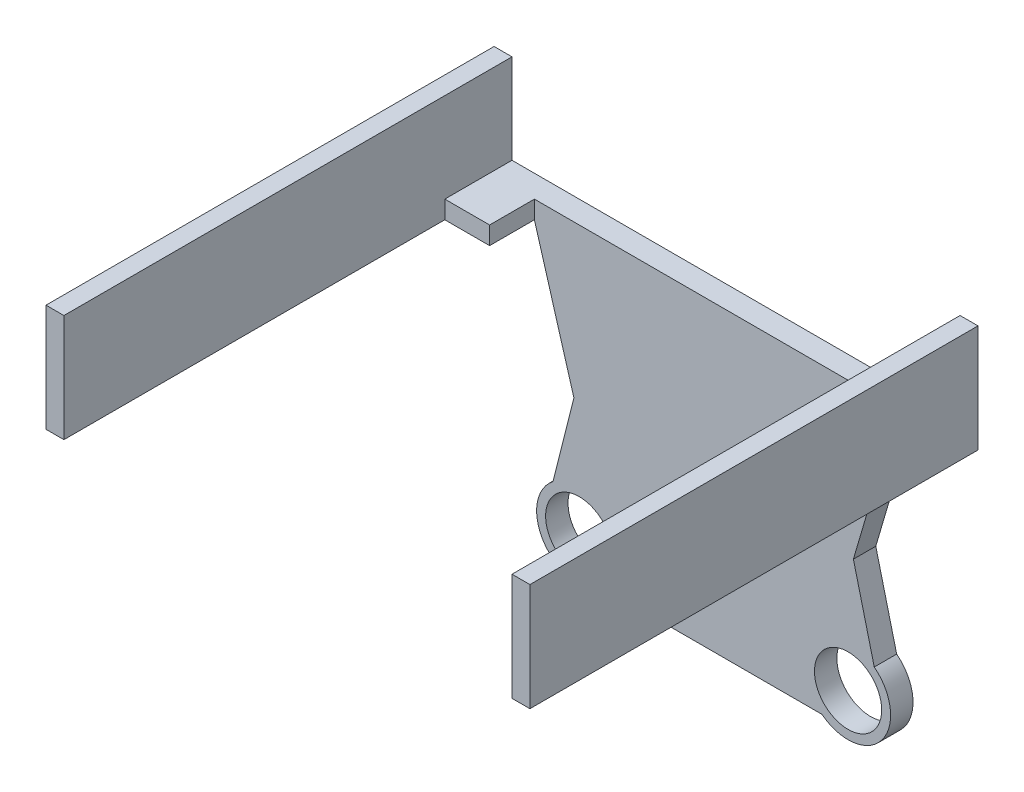
ISO-10303-21;
HEADER;
FILE_DESCRIPTION(('STEP AP214'),'2;1');
FILE_NAME('part.step','',(''),(''),'','','');
FILE_SCHEMA(('AUTOMOTIVE_DESIGN { 1 0 10303 214 1 1 1 1 }'));
ENDSEC;
DATA;
#1=APPLICATION_CONTEXT('core data for automotive mechanical design processes');
#2=APPLICATION_PROTOCOL_DEFINITION('international standard','automotive_design',2000,#1);
#3=PRODUCT_CONTEXT('',#1,'mechanical');
#4=PRODUCT('Part','Part','',(#3));
#5=PRODUCT_RELATED_PRODUCT_CATEGORY('part','',(#4));
#6=PRODUCT_DEFINITION_FORMATION('','',#4);
#7=PRODUCT_DEFINITION_CONTEXT('part definition',#1,'design');
#8=PRODUCT_DEFINITION('design','',#6,#7);
#9=PRODUCT_DEFINITION_SHAPE('','',#8);
#10=(LENGTH_UNIT() NAMED_UNIT(*) SI_UNIT(.MILLI.,.METRE.));
#11=(NAMED_UNIT(*) PLANE_ANGLE_UNIT() SI_UNIT($,.RADIAN.));
#12=(NAMED_UNIT(*) SI_UNIT($,.STERADIAN.) SOLID_ANGLE_UNIT());
#13=UNCERTAINTY_MEASURE_WITH_UNIT(LENGTH_MEASURE(1.E-05),#10,'distance_accuracy_value','');
#14=(GEOMETRIC_REPRESENTATION_CONTEXT(3) GLOBAL_UNCERTAINTY_ASSIGNED_CONTEXT((#13)) GLOBAL_UNIT_ASSIGNED_CONTEXT((#10,
#11,#12)) REPRESENTATION_CONTEXT('',''));
#15=CARTESIAN_POINT('',(0.,0.,0.));
#16=DIRECTION('',(0.,0.,1.));
#17=DIRECTION('',(1.,0.,0.));
#18=AXIS2_PLACEMENT_3D('',#15,#16,#17);
#19=CARTESIAN_POINT('',(0.,0.,2.5));
#20=DIRECTION('',(0.,0.,1.));
#21=DIRECTION('',(1.,0.,0.));
#22=AXIS2_PLACEMENT_3D('',#19,#20,#21);
#23=PLANE('',#22);
#24=CARTESIAN_POINT('',(15.,185.,2.5));
#25=DIRECTION('',(0.,0.,1.));
#26=DIRECTION('',(1.,0.,0.));
#27=AXIS2_PLACEMENT_3D('',#24,#25,#26);
#28=CIRCLE('',#27,3.75);
#29=CARTESIAN_POINT('',(18.75,185.,2.5));
#30=VERTEX_POINT('',#29);
#31=EDGE_CURVE('E261',#30,#30,#28,.T.);
#32=ORIENTED_EDGE('',*,*,#31,.F.);
#33=EDGE_LOOP('',(#32));
#34=FACE_BOUND('',#33,.T.);
#35=CARTESIAN_POINT('',(-15.,185.,2.5));
#36=DIRECTION('',(0.,0.,1.));
#37=DIRECTION('',(1.,0.,0.));
#38=AXIS2_PLACEMENT_3D('',#35,#36,#37);
#39=CIRCLE('',#38,3.75);
#40=CARTESIAN_POINT('',(-11.25,185.,2.5));
#41=VERTEX_POINT('',#40);
#42=EDGE_CURVE('E264',#41,#41,#39,.T.);
#43=ORIENTED_EDGE('',*,*,#42,.F.);
#44=EDGE_LOOP('',(#43));
#45=FACE_BOUND('',#44,.T.);
#46=DIRECTION('',(1.,0.,0.));
#47=VECTOR('',#46,1.);
#48=CARTESIAN_POINT('',(0.,215.,2.5));
#49=LINE('',#48,#47);
#50=CARTESIAN_POINT('',(-20.,215.,2.5));
#51=VERTEX_POINT('',#50);
#52=CARTESIAN_POINT('',(20.,215.,2.5));
#53=VERTEX_POINT('',#52);
#54=EDGE_CURVE('E56',#51,#53,#49,.T.);
#55=ORIENTED_EDGE('',*,*,#54,.F.);
#56=DIRECTION('',(0.,1.,0.));
#57=VECTOR('',#56,1.);
#58=CARTESIAN_POINT('',(-20.,213.,2.5));
#59=LINE('',#58,#57);
#60=CARTESIAN_POINT('',(-20.,213.,2.5));
#61=VERTEX_POINT('',#60);
#62=EDGE_CURVE('E214',#61,#51,#59,.T.);
#63=ORIENTED_EDGE('',*,*,#62,.F.);
#64=DIRECTION('',(0.281819559619809,-0.959467423009086,0.));
#65=VECTOR('',#64,1.);
#66=CARTESIAN_POINT('',(39.1829395341665,11.5090085388171,2.5));
#67=LINE('',#66,#65);
#68=CARTESIAN_POINT('',(-15.594125143885,198.,2.5));
#69=VERTEX_POINT('',#68);
#70=EDGE_CURVE('E280',#61,#69,#67,.T.);
#71=ORIENTED_EDGE('',*,*,#70,.T.);
#72=DIRECTION('',(-0.244142574636941,-0.969739348098058,0.));
#73=VECTOR('',#72,1.);
#74=CARTESIAN_POINT('',(-61.542050920823,15.4938899712752,2.5));
#75=LINE('',#74,#73);
#76=CARTESIAN_POINT('',(-17.9247307512719,188.742786399538,2.5));
#77=VERTEX_POINT('',#76);
#78=EDGE_CURVE('E282',#69,#77,#75,.T.);
#79=ORIENTED_EDGE('',*,*,#78,.T.);
#80=CARTESIAN_POINT('',(-15.,185.,2.5));
#81=DIRECTION('',(0.,0.,1.));
#82=DIRECTION('',(1.,0.,0.));
#83=AXIS2_PLACEMENT_3D('',#80,#81,#82);
#84=CIRCLE('',#83,4.75000000000001);
#85=CARTESIAN_POINT('',(-12.0845240525773,181.25,2.5));
#86=VERTEX_POINT('',#85);
#87=EDGE_CURVE('E284',#77,#86,#84,.T.);
#88=ORIENTED_EDGE('',*,*,#87,.T.);
#89=DIRECTION('',(1.,0.,0.));
#90=VECTOR('',#89,1.);
#91=CARTESIAN_POINT('',(0.,181.25,2.5));
#92=LINE('',#91,#90);
#93=CARTESIAN_POINT('',(12.0845240525773,181.25,2.5));
#94=VERTEX_POINT('',#93);
#95=EDGE_CURVE('E268',#86,#94,#92,.T.);
#96=ORIENTED_EDGE('',*,*,#95,.T.);
#97=CARTESIAN_POINT('',(15.,185.,2.5));
#98=DIRECTION('',(0.,0.,1.));
#99=DIRECTION('',(1.,0.,0.));
#100=AXIS2_PLACEMENT_3D('',#97,#98,#99);
#101=CIRCLE('',#100,4.75);
#102=CARTESIAN_POINT('',(17.9247307512719,188.742786399538,2.5));
#103=VERTEX_POINT('',#102);
#104=EDGE_CURVE('E271',#94,#103,#101,.T.);
#105=ORIENTED_EDGE('',*,*,#104,.T.);
#106=DIRECTION('',(0.244142574636941,-0.969739348098058,0.));
#107=VECTOR('',#106,1.);
#108=CARTESIAN_POINT('',(61.542050920823,15.4938899712752,2.5));
#109=LINE('',#108,#107);
#110=CARTESIAN_POINT('',(15.5941251438851,198.,2.5));
#111=VERTEX_POINT('',#110);
#112=EDGE_CURVE('E273',#111,#103,#109,.T.);
#113=ORIENTED_EDGE('',*,*,#112,.F.);
#114=DIRECTION('',(-0.281819559619809,-0.959467423009086,0.));
#115=VECTOR('',#114,1.);
#116=CARTESIAN_POINT('',(-39.1829395341665,11.5090085388171,2.5));
#117=LINE('',#116,#115);
#118=CARTESIAN_POINT('',(20.,213.,2.5));
#119=VERTEX_POINT('',#118);
#120=EDGE_CURVE('E276',#119,#111,#117,.T.);
#121=ORIENTED_EDGE('',*,*,#120,.F.);
#122=DIRECTION('',(0.,-1.,0.));
#123=VECTOR('',#122,1.);
#124=CARTESIAN_POINT('',(20.,213.,2.5));
#125=LINE('',#124,#123);
#126=EDGE_CURVE('E216',#53,#119,#125,.T.);
#127=ORIENTED_EDGE('',*,*,#126,.F.);
#128=EDGE_LOOP('',(#55,#63,#71,#79,#88,#96,#105,#113,#121,#127));
#129=FACE_BOUND('',#128,.T.);
#130=ADVANCED_FACE('F41',(#34,#45,#129),#23,.T.);
#131=CARTESIAN_POINT('',(25.,0.,2.5));
#132=DIRECTION('',(1.,0.,0.));
#133=DIRECTION('',(0.,0.,-1.));
#134=AXIS2_PLACEMENT_3D('',#131,#132,#133);
#135=PLANE('',#134);
#136=DIRECTION('',(0.,0.,-1.));
#137=VECTOR('',#136,1.);
#138=CARTESIAN_POINT('',(25.,215.,2.5));
#139=LINE('',#138,#137);
#140=CARTESIAN_POINT('',(25.,215.,7.5));
#141=VERTEX_POINT('',#140);
#142=CARTESIAN_POINT('',(25.,215.,0.));
#143=VERTEX_POINT('',#142);
#144=EDGE_CURVE('E351',#141,#143,#139,.T.);
#145=ORIENTED_EDGE('',*,*,#144,.F.);
#146=DIRECTION('',(0.,1.,0.));
#147=VECTOR('',#146,1.);
#148=CARTESIAN_POINT('',(25.,213.,7.5));
#149=LINE('',#148,#147);
#150=CARTESIAN_POINT('',(25.,213.,7.5));
#151=VERTEX_POINT('',#150);
#152=EDGE_CURVE('E225',#151,#141,#149,.T.);
#153=ORIENTED_EDGE('',*,*,#152,.F.);
#154=DIRECTION('',(0.,0.,-1.));
#155=VECTOR('',#154,1.);
#156=CARTESIAN_POINT('',(25.,213.,2.5));
#157=LINE('',#156,#155);
#158=CARTESIAN_POINT('',(25.,213.,50.));
#159=VERTEX_POINT('',#158);
#160=EDGE_CURVE('E233',#159,#151,#157,.T.);
#161=ORIENTED_EDGE('',*,*,#160,.F.);
#162=DIRECTION('',(0.,1.,0.));
#163=VECTOR('',#162,1.);
#164=CARTESIAN_POINT('',(25.,165.457913381931,50.));
#165=LINE('',#164,#163);
#166=CARTESIAN_POINT('',(25.,225.,50.));
#167=VERTEX_POINT('',#166);
#168=EDGE_CURVE('E243',#159,#167,#165,.T.);
#169=ORIENTED_EDGE('',*,*,#168,.T.);
#170=DIRECTION('',(0.,0.,-1.));
#171=VECTOR('',#170,1.);
#172=CARTESIAN_POINT('',(25.,225.,2.5));
#173=LINE('',#172,#171);
#174=CARTESIAN_POINT('',(25.,225.,0.));
#175=VERTEX_POINT('',#174);
#176=EDGE_CURVE('E353',#167,#175,#173,.T.);
#177=ORIENTED_EDGE('',*,*,#176,.T.);
#178=DIRECTION('',(0.,-1.,0.));
#179=VECTOR('',#178,1.);
#180=CARTESIAN_POINT('',(25.,0.,0.));
#181=LINE('',#180,#179);
#182=EDGE_CURVE('E313',#175,#143,#181,.T.);
#183=ORIENTED_EDGE('',*,*,#182,.T.);
#184=EDGE_LOOP('',(#145,#153,#161,#169,#177,#183));
#185=FACE_BOUND('',#184,.T.);
#186=ADVANCED_FACE('F413',(#185),#135,.F.);
#187=CARTESIAN_POINT('',(-25.,0.,2.5));
#188=DIRECTION('',(-1.,0.,0.));
#189=DIRECTION('',(0.,0.,1.));
#190=AXIS2_PLACEMENT_3D('',#187,#188,#189);
#191=PLANE('',#190);
#192=DIRECTION('',(0.,-1.,0.));
#193=VECTOR('',#192,1.);
#194=CARTESIAN_POINT('',(-25.,213.,7.5));
#195=LINE('',#194,#193);
#196=CARTESIAN_POINT('',(-25.,215.,7.5));
#197=VERTEX_POINT('',#196);
#198=CARTESIAN_POINT('',(-25.,213.,7.5));
#199=VERTEX_POINT('',#198);
#200=EDGE_CURVE('E194',#197,#199,#195,.T.);
#201=ORIENTED_EDGE('',*,*,#200,.F.);
#202=DIRECTION('',(0.,0.,-1.));
#203=VECTOR('',#202,1.);
#204=CARTESIAN_POINT('',(-25.,215.,2.5));
#205=LINE('',#204,#203);
#206=CARTESIAN_POINT('',(-25.,215.,0.));
#207=VERTEX_POINT('',#206);
#208=EDGE_CURVE('E64',#197,#207,#205,.T.);
#209=ORIENTED_EDGE('',*,*,#208,.T.);
#210=DIRECTION('',(0.,1.,0.));
#211=VECTOR('',#210,1.);
#212=CARTESIAN_POINT('',(-25.,0.,0.));
#213=LINE('',#212,#211);
#214=CARTESIAN_POINT('',(-25.,225.,0.));
#215=VERTEX_POINT('',#214);
#216=EDGE_CURVE('E319',#207,#215,#213,.T.);
#217=ORIENTED_EDGE('',*,*,#216,.T.);
#218=DIRECTION('',(0.,0.,-1.));
#219=VECTOR('',#218,1.);
#220=CARTESIAN_POINT('',(-25.,225.,2.5));
#221=LINE('',#220,#219);
#222=CARTESIAN_POINT('',(-25.,225.,50.));
#223=VERTEX_POINT('',#222);
#224=EDGE_CURVE('E347',#223,#215,#221,.T.);
#225=ORIENTED_EDGE('',*,*,#224,.F.);
#226=DIRECTION('',(0.,1.,0.));
#227=VECTOR('',#226,1.);
#228=CARTESIAN_POINT('',(-25.,165.457913381931,50.));
#229=LINE('',#228,#227);
#230=CARTESIAN_POINT('',(-25.,213.,50.));
#231=VERTEX_POINT('',#230);
#232=EDGE_CURVE('E255',#231,#223,#229,.T.);
#233=ORIENTED_EDGE('',*,*,#232,.F.);
#234=DIRECTION('',(0.,0.,1.));
#235=VECTOR('',#234,1.);
#236=CARTESIAN_POINT('',(-25.,213.,2.5));
#237=LINE('',#236,#235);
#238=EDGE_CURVE('E251',#199,#231,#237,.T.);
#239=ORIENTED_EDGE('',*,*,#238,.F.);
#240=EDGE_LOOP('',(#201,#209,#217,#225,#233,#239));
#241=FACE_BOUND('',#240,.T.);
#242=ADVANCED_FACE('F453',(#241),#191,.F.);
#243=CARTESIAN_POINT('',(0.,181.25,2.5));
#244=DIRECTION('',(0.,1.,0.));
#245=DIRECTION('',(0.,0.,1.));
#246=AXIS2_PLACEMENT_3D('',#243,#244,#245);
#247=PLANE('',#246);
#248=DIRECTION('',(1.,0.,0.));
#249=VECTOR('',#248,1.);
#250=CARTESIAN_POINT('',(0.,181.25,0.));
#251=LINE('',#250,#249);
#252=CARTESIAN_POINT('',(-12.0845240525773,181.25,0.));
#253=VERTEX_POINT('',#252);
#254=CARTESIAN_POINT('',(12.0845240525773,181.25,0.));
#255=VERTEX_POINT('',#254);
#256=EDGE_CURVE('E292',#253,#255,#251,.T.);
#257=ORIENTED_EDGE('',*,*,#256,.T.);
#258=DIRECTION('',(0.,0.,-1.));
#259=VECTOR('',#258,1.);
#260=CARTESIAN_POINT('',(12.0845240525773,181.25,2.5));
#261=LINE('',#260,#259);
#262=EDGE_CURVE('E11',#94,#255,#261,.T.);
#263=ORIENTED_EDGE('',*,*,#262,.F.);
#264=ORIENTED_EDGE('',*,*,#95,.F.);
#265=DIRECTION('',(0.,0.,-1.));
#266=VECTOR('',#265,1.);
#267=CARTESIAN_POINT('',(-12.0845240525773,181.25,2.5));
#268=LINE('',#267,#266);
#269=EDGE_CURVE('E286',#86,#253,#268,.T.);
#270=ORIENTED_EDGE('',*,*,#269,.T.);
#271=EDGE_LOOP('',(#257,#263,#264,#270));
#272=FACE_BOUND('',#271,.T.);
#273=ADVANCED_FACE('F383',(#272),#247,.F.);
#274=CARTESIAN_POINT('',(15.,185.,2.5));
#275=DIRECTION('',(0.,0.,-1.));
#276=DIRECTION('',(-1.,0.,0.));
#277=AXIS2_PLACEMENT_3D('',#274,#275,#276);
#278=CYLINDRICAL_SURFACE('',#277,4.75);
#279=CARTESIAN_POINT('',(15.,185.,0.));
#280=DIRECTION('',(0.,0.,1.));
#281=DIRECTION('',(1.,0.,0.));
#282=AXIS2_PLACEMENT_3D('',#279,#280,#281);
#283=CIRCLE('',#282,4.75);
#284=CARTESIAN_POINT('',(17.9247307512719,188.742786399538,0.));
#285=VERTEX_POINT('',#284);
#286=EDGE_CURVE('E295',#255,#285,#283,.T.);
#287=ORIENTED_EDGE('',*,*,#286,.T.);
#288=DIRECTION('',(0.,0.,-1.));
#289=VECTOR('',#288,1.);
#290=CARTESIAN_POINT('',(17.9247307512719,188.742786399538,2.5));
#291=LINE('',#290,#289);
#292=EDGE_CURVE('E49',#103,#285,#291,.T.);
#293=ORIENTED_EDGE('',*,*,#292,.F.);
#294=ORIENTED_EDGE('',*,*,#104,.F.);
#295=ORIENTED_EDGE('',*,*,#262,.T.);
#296=EDGE_LOOP('',(#287,#293,#294,#295));
#297=FACE_BOUND('',#296,.T.);
#298=ADVANCED_FACE('F368',(#297),#278,.T.);
#299=CARTESIAN_POINT('',(61.542050920823,15.4938899712752,2.5));
#300=DIRECTION('',(0.969739348098058,0.244142574636941,0.));
#301=DIRECTION('',(-0.244142574636941,0.969739348098058,0.));
#302=AXIS2_PLACEMENT_3D('',#299,#300,#301);
#303=PLANE('',#302);
#304=DIRECTION('',(0.244142574636941,-0.969739348098058,0.));
#305=VECTOR('',#304,1.);
#306=CARTESIAN_POINT('',(61.542050920823,15.4938899712752,0.));
#307=LINE('',#306,#305);
#308=CARTESIAN_POINT('',(15.5941251438851,198.,0.));
#309=VERTEX_POINT('',#308);
#310=EDGE_CURVE('E298',#309,#285,#307,.T.);
#311=ORIENTED_EDGE('',*,*,#310,.F.);
#312=DIRECTION('',(0.,0.,-1.));
#313=VECTOR('',#312,1.);
#314=CARTESIAN_POINT('',(15.5941251438851,198.,2.5));
#315=LINE('',#314,#313);
#316=EDGE_CURVE('E361',#111,#309,#315,.T.);
#317=ORIENTED_EDGE('',*,*,#316,.F.);
#318=ORIENTED_EDGE('',*,*,#112,.T.);
#319=ORIENTED_EDGE('',*,*,#292,.T.);
#320=EDGE_LOOP('',(#311,#317,#318,#319));
#321=FACE_BOUND('',#320,.T.);
#322=ADVANCED_FACE('F365',(#321),#303,.T.);
#323=CARTESIAN_POINT('',(-39.1829395341665,11.5090085388171,2.5));
#324=DIRECTION('',(0.959467423009086,-0.281819559619809,0.));
#325=DIRECTION('',(0.281819559619809,0.959467423009086,0.));
#326=AXIS2_PLACEMENT_3D('',#323,#324,#325);
#327=PLANE('',#326);
#328=DIRECTION('',(-0.281819559619809,-0.959467423009086,0.));
#329=VECTOR('',#328,1.);
#330=CARTESIAN_POINT('',(-39.1829395341665,11.5090085388171,0.));
#331=LINE('',#330,#329);
#332=CARTESIAN_POINT('',(20.,213.,0.));
#333=VERTEX_POINT('',#332);
#334=EDGE_CURVE('E301',#333,#309,#331,.T.);
#335=ORIENTED_EDGE('',*,*,#334,.F.);
#336=DIRECTION('',(0.,0.,-1.));
#337=VECTOR('',#336,1.);
#338=CARTESIAN_POINT('',(20.,213.,2.5));
#339=LINE('',#338,#337);
#340=EDGE_CURVE('E359',#119,#333,#339,.T.);
#341=ORIENTED_EDGE('',*,*,#340,.F.);
#342=ORIENTED_EDGE('',*,*,#120,.T.);
#343=ORIENTED_EDGE('',*,*,#316,.T.);
#344=EDGE_LOOP('',(#335,#341,#342,#343));
#345=FACE_BOUND('',#344,.T.);
#346=ADVANCED_FACE('F377',(#345),#327,.T.);
#347=CARTESIAN_POINT('',(0.,213.,2.5));
#348=DIRECTION('',(0.,1.,0.));
#349=DIRECTION('',(0.,0.,1.));
#350=AXIS2_PLACEMENT_3D('',#347,#348,#349);
#351=PLANE('',#350);
#352=DIRECTION('',(1.,0.,0.));
#353=VECTOR('',#352,1.);
#354=CARTESIAN_POINT('',(0.,213.,0.));
#355=LINE('',#354,#353);
#356=CARTESIAN_POINT('',(27.,213.,0.));
#357=VERTEX_POINT('',#356);
#358=EDGE_CURVE('E304',#333,#357,#355,.T.);
#359=ORIENTED_EDGE('',*,*,#358,.T.);
#360=DIRECTION('',(0.,0.,-1.));
#361=VECTOR('',#360,1.);
#362=CARTESIAN_POINT('',(27.,213.,2.5));
#363=LINE('',#362,#361);
#364=CARTESIAN_POINT('',(27.,213.,50.));
#365=VERTEX_POINT('',#364);
#366=EDGE_CURVE('E357',#365,#357,#363,.T.);
#367=ORIENTED_EDGE('',*,*,#366,.F.);
#368=DIRECTION('',(-1.,0.,0.));
#369=VECTOR('',#368,1.);
#370=CARTESIAN_POINT('',(27.,213.,50.));
#371=LINE('',#370,#369);
#372=EDGE_CURVE('E236',#365,#159,#371,.T.);
#373=ORIENTED_EDGE('',*,*,#372,.T.);
#374=ORIENTED_EDGE('',*,*,#160,.T.);
#375=DIRECTION('',(1.,0.,0.));
#376=VECTOR('',#375,1.);
#377=CARTESIAN_POINT('',(25.,213.,7.5));
#378=LINE('',#377,#376);
#379=CARTESIAN_POINT('',(20.,213.,7.5));
#380=VERTEX_POINT('',#379);
#381=EDGE_CURVE('E223',#380,#151,#378,.T.);
#382=ORIENTED_EDGE('',*,*,#381,.F.);
#383=DIRECTION('',(0.,0.,-1.));
#384=VECTOR('',#383,1.);
#385=CARTESIAN_POINT('',(20.,213.,7.5));
#386=LINE('',#385,#384);
#387=EDGE_CURVE('E220',#380,#119,#386,.T.);
#388=ORIENTED_EDGE('',*,*,#387,.T.);
#389=ORIENTED_EDGE('',*,*,#340,.T.);
#390=EDGE_LOOP('',(#359,#367,#373,#374,#382,#388,#389));
#391=FACE_BOUND('',#390,.T.);
#392=ADVANCED_FACE('F424',(#391),#351,.F.);
#393=CARTESIAN_POINT('',(27.,0.,2.5));
#394=DIRECTION('',(1.,0.,0.));
#395=DIRECTION('',(0.,0.,-1.));
#396=AXIS2_PLACEMENT_3D('',#393,#394,#395);
#397=PLANE('',#396);
#398=DIRECTION('',(0.,-1.,0.));
#399=VECTOR('',#398,1.);
#400=CARTESIAN_POINT('',(27.,0.,0.));
#401=LINE('',#400,#399);
#402=CARTESIAN_POINT('',(27.,225.,0.));
#403=VERTEX_POINT('',#402);
#404=EDGE_CURVE('E307',#403,#357,#401,.T.);
#405=ORIENTED_EDGE('',*,*,#404,.F.);
#406=DIRECTION('',(0.,0.,-1.));
#407=VECTOR('',#406,1.);
#408=CARTESIAN_POINT('',(27.,225.,2.5));
#409=LINE('',#408,#407);
#410=CARTESIAN_POINT('',(27.,225.,50.));
#411=VERTEX_POINT('',#410);
#412=EDGE_CURVE('E355',#411,#403,#409,.T.);
#413=ORIENTED_EDGE('',*,*,#412,.F.);
#414=DIRECTION('',(0.,1.,0.));
#415=VECTOR('',#414,1.);
#416=CARTESIAN_POINT('',(27.,165.457913381931,50.));
#417=LINE('',#416,#415);
#418=EDGE_CURVE('E237',#365,#411,#417,.T.);
#419=ORIENTED_EDGE('',*,*,#418,.F.);
#420=ORIENTED_EDGE('',*,*,#366,.T.);
#421=EDGE_LOOP('',(#405,#413,#419,#420));
#422=FACE_BOUND('',#421,.T.);
#423=ADVANCED_FACE('F421',(#422),#397,.T.);
#424=CARTESIAN_POINT('',(0.,225.,2.5));
#425=DIRECTION('',(0.,1.,0.));
#426=DIRECTION('',(0.,0.,1.));
#427=AXIS2_PLACEMENT_3D('',#424,#425,#426);
#428=PLANE('',#427);
#429=DIRECTION('',(1.,0.,0.));
#430=VECTOR('',#429,1.);
#431=CARTESIAN_POINT('',(0.,225.,0.));
#432=LINE('',#431,#430);
#433=EDGE_CURVE('E310',#175,#403,#432,.T.);
#434=ORIENTED_EDGE('',*,*,#433,.F.);
#435=ORIENTED_EDGE('',*,*,#176,.F.);
#436=DIRECTION('',(1.,0.,0.));
#437=VECTOR('',#436,1.);
#438=CARTESIAN_POINT('',(27.,225.,50.));
#439=LINE('',#438,#437);
#440=EDGE_CURVE('E240',#167,#411,#439,.T.);
#441=ORIENTED_EDGE('',*,*,#440,.T.);
#442=ORIENTED_EDGE('',*,*,#412,.T.);
#443=EDGE_LOOP('',(#434,#435,#441,#442));
#444=FACE_BOUND('',#443,.T.);
#445=ADVANCED_FACE('F416',(#444),#428,.T.);
#446=CARTESIAN_POINT('',(0.,215.,2.5));
#447=DIRECTION('',(0.,1.,0.));
#448=DIRECTION('',(0.,0.,1.));
#449=AXIS2_PLACEMENT_3D('',#446,#447,#448);
#450=PLANE('',#449);
#451=DIRECTION('',(1.,0.,0.));
#452=VECTOR('',#451,1.);
#453=CARTESIAN_POINT('',(0.,215.,0.));
#454=LINE('',#453,#452);
#455=EDGE_CURVE('E316',#207,#143,#454,.T.);
#456=ORIENTED_EDGE('',*,*,#455,.F.);
#457=ORIENTED_EDGE('',*,*,#208,.F.);
#458=DIRECTION('',(-1.,0.,0.));
#459=VECTOR('',#458,1.);
#460=CARTESIAN_POINT('',(-25.,215.,7.5));
#461=LINE('',#460,#459);
#462=CARTESIAN_POINT('',(-20.,215.,7.5));
#463=VERTEX_POINT('',#462);
#464=EDGE_CURVE('E209',#463,#197,#461,.T.);
#465=ORIENTED_EDGE('',*,*,#464,.F.);
#466=DIRECTION('',(0.,0.,-1.));
#467=VECTOR('',#466,1.);
#468=CARTESIAN_POINT('',(-20.,215.,7.5));
#469=LINE('',#468,#467);
#470=EDGE_CURVE('E205',#463,#51,#469,.T.);
#471=ORIENTED_EDGE('',*,*,#470,.T.);
#472=ORIENTED_EDGE('',*,*,#54,.T.);
#473=DIRECTION('',(0.,0.,-1.));
#474=VECTOR('',#473,1.);
#475=CARTESIAN_POINT('',(20.,215.,7.5));
#476=LINE('',#475,#474);
#477=CARTESIAN_POINT('',(20.,215.,7.5));
#478=VERTEX_POINT('',#477);
#479=EDGE_CURVE('E218',#478,#53,#476,.T.);
#480=ORIENTED_EDGE('',*,*,#479,.F.);
#481=DIRECTION('',(-1.,0.,0.));
#482=VECTOR('',#481,1.);
#483=CARTESIAN_POINT('',(25.,215.,7.5));
#484=LINE('',#483,#482);
#485=EDGE_CURVE('E229',#141,#478,#484,.T.);
#486=ORIENTED_EDGE('',*,*,#485,.F.);
#487=ORIENTED_EDGE('',*,*,#144,.T.);
#488=EDGE_LOOP('',(#456,#457,#465,#471,#472,#480,#486,#487));
#489=FACE_BOUND('',#488,.T.);
#490=ADVANCED_FACE('F408',(#489),#450,.T.);
#491=CARTESIAN_POINT('',(0.,225.,2.5));
#492=DIRECTION('',(0.,-1.,0.));
#493=DIRECTION('',(0.,0.,-1.));
#494=AXIS2_PLACEMENT_3D('',#491,#492,#493);
#495=PLANE('',#494);
#496=DIRECTION('',(-1.,0.,0.));
#497=VECTOR('',#496,1.);
#498=CARTESIAN_POINT('',(0.,225.,0.));
#499=LINE('',#498,#497);
#500=CARTESIAN_POINT('',(-27.,225.,0.));
#501=VERTEX_POINT('',#500);
#502=EDGE_CURVE('E321',#215,#501,#499,.T.);
#503=ORIENTED_EDGE('',*,*,#502,.T.);
#504=DIRECTION('',(0.,0.,-1.));
#505=VECTOR('',#504,1.);
#506=CARTESIAN_POINT('',(-27.,225.,2.5));
#507=LINE('',#506,#505);
#508=CARTESIAN_POINT('',(-27.,225.,50.));
#509=VERTEX_POINT('',#508);
#510=EDGE_CURVE('E345',#509,#501,#507,.T.);
#511=ORIENTED_EDGE('',*,*,#510,.F.);
#512=DIRECTION('',(1.,0.,0.));
#513=VECTOR('',#512,1.);
#514=CARTESIAN_POINT('',(-27.,225.,50.));
#515=LINE('',#514,#513);
#516=EDGE_CURVE('E244',#509,#223,#515,.T.);
#517=ORIENTED_EDGE('',*,*,#516,.T.);
#518=ORIENTED_EDGE('',*,*,#224,.T.);
#519=EDGE_LOOP('',(#503,#511,#517,#518));
#520=FACE_BOUND('',#519,.T.);
#521=ADVANCED_FACE('F404',(#520),#495,.F.);
#522=CARTESIAN_POINT('',(-27.,0.,2.5));
#523=DIRECTION('',(-1.,0.,0.));
#524=DIRECTION('',(0.,0.,1.));
#525=AXIS2_PLACEMENT_3D('',#522,#523,#524);
#526=PLANE('',#525);
#527=DIRECTION('',(0.,1.,0.));
#528=VECTOR('',#527,1.);
#529=CARTESIAN_POINT('',(-27.,0.,0.));
#530=LINE('',#529,#528);
#531=CARTESIAN_POINT('',(-27.,213.,0.));
#532=VERTEX_POINT('',#531);
#533=EDGE_CURVE('E324',#532,#501,#530,.T.);
#534=ORIENTED_EDGE('',*,*,#533,.F.);
#535=DIRECTION('',(0.,0.,-1.));
#536=VECTOR('',#535,1.);
#537=CARTESIAN_POINT('',(-27.,213.,2.5));
#538=LINE('',#537,#536);
#539=CARTESIAN_POINT('',(-27.,213.,50.));
#540=VERTEX_POINT('',#539);
#541=EDGE_CURVE('E343',#540,#532,#538,.T.);
#542=ORIENTED_EDGE('',*,*,#541,.F.);
#543=DIRECTION('',(0.,1.,0.));
#544=VECTOR('',#543,1.);
#545=CARTESIAN_POINT('',(-27.,165.457913381931,50.));
#546=LINE('',#545,#544);
#547=EDGE_CURVE('E252',#540,#509,#546,.T.);
#548=ORIENTED_EDGE('',*,*,#547,.T.);
#549=ORIENTED_EDGE('',*,*,#510,.T.);
#550=EDGE_LOOP('',(#534,#542,#548,#549));
#551=FACE_BOUND('',#550,.T.);
#552=ADVANCED_FACE('F400',(#551),#526,.T.);
#553=CARTESIAN_POINT('',(0.,213.,2.5));
#554=DIRECTION('',(0.,1.,0.));
#555=DIRECTION('',(0.,0.,1.));
#556=AXIS2_PLACEMENT_3D('',#553,#554,#555);
#557=PLANE('',#556);
#558=DIRECTION('',(1.,0.,0.));
#559=VECTOR('',#558,1.);
#560=CARTESIAN_POINT('',(-25.,213.,7.5));
#561=LINE('',#560,#559);
#562=CARTESIAN_POINT('',(-20.,213.,7.5));
#563=VERTEX_POINT('',#562);
#564=EDGE_CURVE('E187',#199,#563,#561,.T.);
#565=ORIENTED_EDGE('',*,*,#564,.F.);
#566=ORIENTED_EDGE('',*,*,#238,.T.);
#567=DIRECTION('',(-1.,0.,0.));
#568=VECTOR('',#567,1.);
#569=CARTESIAN_POINT('',(-27.,213.,50.));
#570=LINE('',#569,#568);
#571=EDGE_CURVE('E204',#231,#540,#570,.T.);
#572=ORIENTED_EDGE('',*,*,#571,.T.);
#573=ORIENTED_EDGE('',*,*,#541,.T.);
#574=DIRECTION('',(1.,0.,0.));
#575=VECTOR('',#574,1.);
#576=CARTESIAN_POINT('',(0.,213.,0.));
#577=LINE('',#576,#575);
#578=CARTESIAN_POINT('',(-20.,213.,0.));
#579=VERTEX_POINT('',#578);
#580=EDGE_CURVE('E327',#532,#579,#577,.T.);
#581=ORIENTED_EDGE('',*,*,#580,.T.);
#582=DIRECTION('',(0.,0.,-1.));
#583=VECTOR('',#582,1.);
#584=CARTESIAN_POINT('',(-20.,213.,2.5));
#585=LINE('',#584,#583);
#586=EDGE_CURVE('E202',#61,#579,#585,.T.);
#587=ORIENTED_EDGE('',*,*,#586,.F.);
#588=DIRECTION('',(0.,0.,-1.));
#589=VECTOR('',#588,1.);
#590=CARTESIAN_POINT('',(-20.,213.,7.5));
#591=LINE('',#590,#589);
#592=EDGE_CURVE('E199',#563,#61,#591,.T.);
#593=ORIENTED_EDGE('',*,*,#592,.F.);
#594=EDGE_LOOP('',(#565,#566,#572,#573,#581,#587,#593));
#595=FACE_BOUND('',#594,.T.);
#596=ADVANCED_FACE('F200',(#595),#557,.F.);
#597=CARTESIAN_POINT('',(39.1829395341665,11.5090085388171,2.5));
#598=DIRECTION('',(0.959467423009086,0.281819559619809,0.));
#599=DIRECTION('',(-0.281819559619809,0.959467423009086,0.));
#600=AXIS2_PLACEMENT_3D('',#597,#598,#599);
#601=PLANE('',#600);
#602=DIRECTION('',(0.281819559619809,-0.959467423009086,0.));
#603=VECTOR('',#602,1.);
#604=CARTESIAN_POINT('',(39.1829395341665,11.5090085388171,0.));
#605=LINE('',#604,#603);
#606=CARTESIAN_POINT('',(-15.594125143885,198.,0.));
#607=VERTEX_POINT('',#606);
#608=EDGE_CURVE('E329',#579,#607,#605,.T.);
#609=ORIENTED_EDGE('',*,*,#608,.T.);
#610=DIRECTION('',(0.,0.,-1.));
#611=VECTOR('',#610,1.);
#612=CARTESIAN_POINT('',(-15.594125143885,198.,2.5));
#613=LINE('',#612,#611);
#614=EDGE_CURVE('E339',#69,#607,#613,.T.);
#615=ORIENTED_EDGE('',*,*,#614,.F.);
#616=ORIENTED_EDGE('',*,*,#70,.F.);
#617=ORIENTED_EDGE('',*,*,#586,.T.);
#618=EDGE_LOOP('',(#609,#615,#616,#617));
#619=FACE_BOUND('',#618,.T.);
#620=ADVANCED_FACE('F395',(#619),#601,.F.);
#621=CARTESIAN_POINT('',(-61.542050920823,15.4938899712752,2.5));
#622=DIRECTION('',(0.969739348098058,-0.244142574636941,0.));
#623=DIRECTION('',(0.244142574636941,0.969739348098058,0.));
#624=AXIS2_PLACEMENT_3D('',#621,#622,#623);
#625=PLANE('',#624);
#626=DIRECTION('',(-0.244142574636941,-0.969739348098058,0.));
#627=VECTOR('',#626,1.);
#628=CARTESIAN_POINT('',(-61.542050920823,15.4938899712752,0.));
#629=LINE('',#628,#627);
#630=CARTESIAN_POINT('',(-17.9247307512719,188.742786399538,0.));
#631=VERTEX_POINT('',#630);
#632=EDGE_CURVE('E331',#607,#631,#629,.T.);
#633=ORIENTED_EDGE('',*,*,#632,.T.);
#634=DIRECTION('',(0.,0.,-1.));
#635=VECTOR('',#634,1.);
#636=CARTESIAN_POINT('',(-17.9247307512719,188.742786399538,2.5));
#637=LINE('',#636,#635);
#638=EDGE_CURVE('E336',#77,#631,#637,.T.);
#639=ORIENTED_EDGE('',*,*,#638,.F.);
#640=ORIENTED_EDGE('',*,*,#78,.F.);
#641=ORIENTED_EDGE('',*,*,#614,.T.);
#642=EDGE_LOOP('',(#633,#639,#640,#641));
#643=FACE_BOUND('',#642,.T.);
#644=ADVANCED_FACE('F392',(#643),#625,.F.);
#645=CARTESIAN_POINT('',(-15.,185.,2.5));
#646=DIRECTION('',(0.,0.,-1.));
#647=DIRECTION('',(-1.,0.,0.));
#648=AXIS2_PLACEMENT_3D('',#645,#646,#647);
#649=CYLINDRICAL_SURFACE('',#648,3.75);
#650=ORIENTED_EDGE('',*,*,#42,.T.);
#651=EDGE_LOOP('',(#650));
#652=FACE_BOUND('',#651,.T.);
#653=CARTESIAN_POINT('',(-15.,185.,0.));
#654=DIRECTION('',(0.,0.,1.));
#655=DIRECTION('',(1.,0.,0.));
#656=AXIS2_PLACEMENT_3D('',#653,#654,#655);
#657=CIRCLE('',#656,3.75);
#658=CARTESIAN_POINT('',(-11.25,185.,0.));
#659=VERTEX_POINT('',#658);
#660=EDGE_CURVE('E289',#659,#659,#657,.T.);
#661=ORIENTED_EDGE('',*,*,#660,.F.);
#662=EDGE_LOOP('',(#661));
#663=FACE_BOUND('',#662,.T.);
#664=ADVANCED_FACE('F465',(#652,#663),#649,.F.);
#665=CARTESIAN_POINT('',(15.,185.,2.5));
#666=DIRECTION('',(0.,0.,-1.));
#667=DIRECTION('',(-1.,0.,0.));
#668=AXIS2_PLACEMENT_3D('',#665,#666,#667);
#669=CYLINDRICAL_SURFACE('',#668,3.75);
#670=ORIENTED_EDGE('',*,*,#31,.T.);
#671=EDGE_LOOP('',(#670));
#672=FACE_BOUND('',#671,.T.);
#673=CARTESIAN_POINT('',(15.,185.,0.));
#674=DIRECTION('',(0.,0.,1.));
#675=DIRECTION('',(1.,0.,0.));
#676=AXIS2_PLACEMENT_3D('',#673,#674,#675);
#677=CIRCLE('',#676,3.75);
#678=CARTESIAN_POINT('',(18.75,185.,0.));
#679=VERTEX_POINT('',#678);
#680=EDGE_CURVE('E239',#679,#679,#677,.T.);
#681=ORIENTED_EDGE('',*,*,#680,.F.);
#682=EDGE_LOOP('',(#681));
#683=FACE_BOUND('',#682,.T.);
#684=ADVANCED_FACE('F43',(#672,#683),#669,.F.);
#685=CARTESIAN_POINT('',(-15.,185.,2.5));
#686=DIRECTION('',(0.,0.,-1.));
#687=DIRECTION('',(-1.,0.,0.));
#688=AXIS2_PLACEMENT_3D('',#685,#686,#687);
#689=CYLINDRICAL_SURFACE('',#688,4.75000000000001);
#690=CARTESIAN_POINT('',(-15.,185.,0.));
#691=DIRECTION('',(0.,0.,1.));
#692=DIRECTION('',(1.,0.,0.));
#693=AXIS2_PLACEMENT_3D('',#690,#691,#692);
#694=CIRCLE('',#693,4.75000000000001);
#695=EDGE_CURVE('E265',#631,#253,#694,.T.);
#696=ORIENTED_EDGE('',*,*,#695,.T.);
#697=ORIENTED_EDGE('',*,*,#269,.F.);
#698=ORIENTED_EDGE('',*,*,#87,.F.);
#699=ORIENTED_EDGE('',*,*,#638,.T.);
#700=EDGE_LOOP('',(#696,#697,#698,#699));
#701=FACE_BOUND('',#700,.T.);
#702=ADVANCED_FACE('F388',(#701),#689,.T.);
#703=CARTESIAN_POINT('',(0.,0.,0.));
#704=DIRECTION('',(0.,0.,1.));
#705=DIRECTION('',(1.,0.,0.));
#706=AXIS2_PLACEMENT_3D('',#703,#704,#705);
#707=PLANE('',#706);
#708=ORIENTED_EDGE('',*,*,#680,.T.);
#709=EDGE_LOOP('',(#708));
#710=FACE_BOUND('',#709,.T.);
#711=ORIENTED_EDGE('',*,*,#660,.T.);
#712=EDGE_LOOP('',(#711));
#713=FACE_BOUND('',#712,.T.);
#714=ORIENTED_EDGE('',*,*,#256,.F.);
#715=ORIENTED_EDGE('',*,*,#695,.F.);
#716=ORIENTED_EDGE('',*,*,#632,.F.);
#717=ORIENTED_EDGE('',*,*,#608,.F.);
#718=ORIENTED_EDGE('',*,*,#580,.F.);
#719=ORIENTED_EDGE('',*,*,#533,.T.);
#720=ORIENTED_EDGE('',*,*,#502,.F.);
#721=ORIENTED_EDGE('',*,*,#216,.F.);
#722=ORIENTED_EDGE('',*,*,#455,.T.);
#723=ORIENTED_EDGE('',*,*,#182,.F.);
#724=ORIENTED_EDGE('',*,*,#433,.T.);
#725=ORIENTED_EDGE('',*,*,#404,.T.);
#726=ORIENTED_EDGE('',*,*,#358,.F.);
#727=ORIENTED_EDGE('',*,*,#334,.T.);
#728=ORIENTED_EDGE('',*,*,#310,.T.);
#729=ORIENTED_EDGE('',*,*,#286,.F.);
#730=EDGE_LOOP('',(#714,#715,#716,#717,#718,#719,#720,#721,#722,#723,#724,#725,#726,#727,#728,#729));
#731=FACE_BOUND('',#730,.T.);
#732=ADVANCED_FACE('F372',(#710,#713,#731),#707,.F.);
#733=CARTESIAN_POINT('',(-27.,165.457913381931,50.));
#734=DIRECTION('',(0.,0.,1.));
#735=DIRECTION('',(1.,0.,0.));
#736=AXIS2_PLACEMENT_3D('',#733,#734,#735);
#737=PLANE('',#736);
#738=ORIENTED_EDGE('',*,*,#571,.F.);
#739=ORIENTED_EDGE('',*,*,#232,.T.);
#740=ORIENTED_EDGE('',*,*,#516,.F.);
#741=ORIENTED_EDGE('',*,*,#547,.F.);
#742=EDGE_LOOP('',(#738,#739,#740,#741));
#743=FACE_BOUND('',#742,.T.);
#744=ADVANCED_FACE('F437',(#743),#737,.T.);
#745=CARTESIAN_POINT('',(27.,165.457913381931,50.));
#746=DIRECTION('',(0.,0.,1.));
#747=DIRECTION('',(1.,0.,0.));
#748=AXIS2_PLACEMENT_3D('',#745,#746,#747);
#749=PLANE('',#748);
#750=ORIENTED_EDGE('',*,*,#372,.F.);
#751=ORIENTED_EDGE('',*,*,#418,.T.);
#752=ORIENTED_EDGE('',*,*,#440,.F.);
#753=ORIENTED_EDGE('',*,*,#168,.F.);
#754=EDGE_LOOP('',(#750,#751,#752,#753));
#755=FACE_BOUND('',#754,.T.);
#756=ADVANCED_FACE('F435',(#755),#749,.T.);
#757=CARTESIAN_POINT('',(-20.,213.,7.5));
#758=DIRECTION('',(-1.,0.,0.));
#759=DIRECTION('',(0.,0.,1.));
#760=AXIS2_PLACEMENT_3D('',#757,#758,#759);
#761=PLANE('',#760);
#762=ORIENTED_EDGE('',*,*,#62,.T.);
#763=ORIENTED_EDGE('',*,*,#470,.F.);
#764=DIRECTION('',(0.,1.,0.));
#765=VECTOR('',#764,1.);
#766=CARTESIAN_POINT('',(-20.,213.,7.5));
#767=LINE('',#766,#765);
#768=EDGE_CURVE('E192',#563,#463,#767,.T.);
#769=ORIENTED_EDGE('',*,*,#768,.F.);
#770=ORIENTED_EDGE('',*,*,#592,.T.);
#771=EDGE_LOOP('',(#762,#763,#769,#770));
#772=FACE_BOUND('',#771,.T.);
#773=ADVANCED_FACE('F207',(#772),#761,.F.);
#774=CARTESIAN_POINT('',(0.,0.,7.5));
#775=DIRECTION('',(0.,0.,-1.));
#776=DIRECTION('',(-1.,0.,0.));
#777=AXIS2_PLACEMENT_3D('',#774,#775,#776);
#778=PLANE('',#777);
#779=ORIENTED_EDGE('',*,*,#200,.T.);
#780=ORIENTED_EDGE('',*,*,#564,.T.);
#781=ORIENTED_EDGE('',*,*,#768,.T.);
#782=ORIENTED_EDGE('',*,*,#464,.T.);
#783=EDGE_LOOP('',(#779,#780,#781,#782));
#784=FACE_BOUND('',#783,.T.);
#785=ADVANCED_FACE('F189',(#784),#778,.F.);
#786=CARTESIAN_POINT('',(20.,213.,7.5));
#787=DIRECTION('',(1.,0.,0.));
#788=DIRECTION('',(0.,1.,0.));
#789=AXIS2_PLACEMENT_3D('',#786,#787,#788);
#790=PLANE('',#789);
#791=ORIENTED_EDGE('',*,*,#126,.T.);
#792=ORIENTED_EDGE('',*,*,#387,.F.);
#793=DIRECTION('',(0.,-1.,0.));
#794=VECTOR('',#793,1.);
#795=CARTESIAN_POINT('',(20.,213.,7.5));
#796=LINE('',#795,#794);
#797=EDGE_CURVE('E227',#478,#380,#796,.T.);
#798=ORIENTED_EDGE('',*,*,#797,.F.);
#799=ORIENTED_EDGE('',*,*,#479,.T.);
#800=EDGE_LOOP('',(#791,#792,#798,#799));
#801=FACE_BOUND('',#800,.T.);
#802=ADVANCED_FACE('F429',(#801),#790,.F.);
#803=CARTESIAN_POINT('',(0.,0.,7.5));
#804=DIRECTION('',(0.,0.,1.));
#805=DIRECTION('',(1.,0.,0.));
#806=AXIS2_PLACEMENT_3D('',#803,#804,#805);
#807=PLANE('',#806);
#808=ORIENTED_EDGE('',*,*,#152,.T.);
#809=ORIENTED_EDGE('',*,*,#485,.T.);
#810=ORIENTED_EDGE('',*,*,#797,.T.);
#811=ORIENTED_EDGE('',*,*,#381,.T.);
#812=EDGE_LOOP('',(#808,#809,#810,#811));
#813=FACE_BOUND('',#812,.T.);
#814=ADVANCED_FACE('F431',(#813),#807,.T.);
#815=CLOSED_SHELL('',(#130,#186,#242,#273,#298,#322,#346,#392,#423,#445,#490,#521,#552,#596,
#620,#644,#664,#684,#702,#732,#744,#756,#773,#785,#802,#814));
#816=MANIFOLD_SOLID_BREP('B2',#815);
#817=ADVANCED_BREP_SHAPE_REPRESENTATION('',(#18,#816),#14);
#818=SHAPE_DEFINITION_REPRESENTATION(#9,#817);
ENDSEC;
END-ISO-10303-21;
